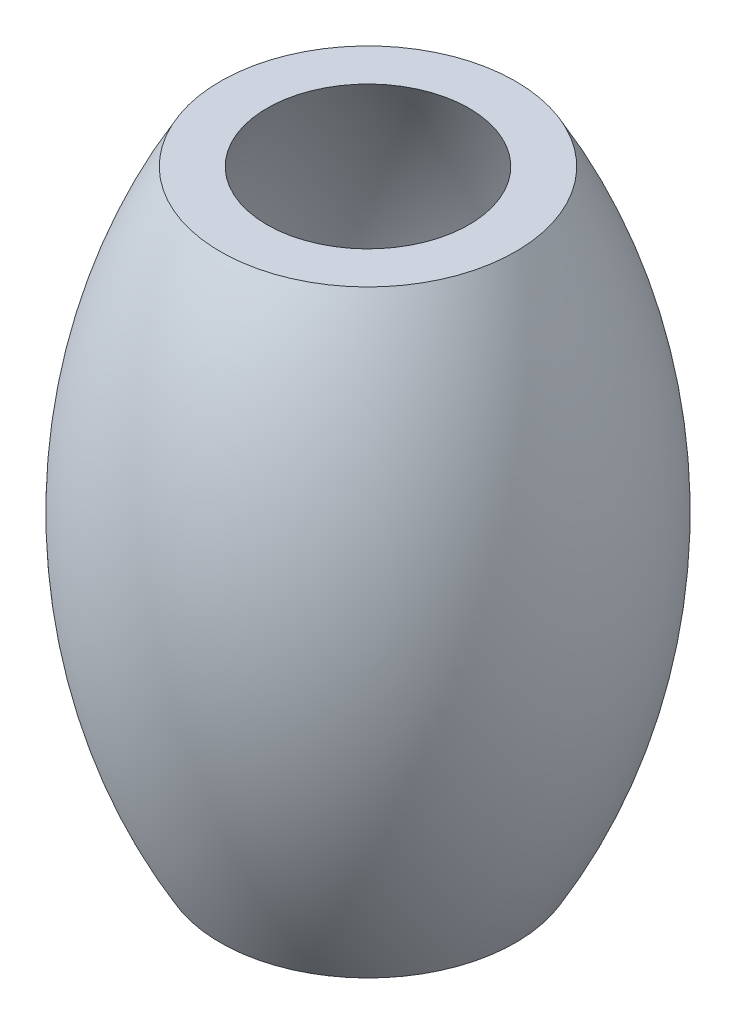
ISO-10303-21;
HEADER;
FILE_DESCRIPTION(('STEP AP214'),'2;1');
FILE_NAME('part.step','',(''),(''),'','','');
FILE_SCHEMA(('AUTOMOTIVE_DESIGN { 1 0 10303 214 1 1 1 1 }'));
ENDSEC;
DATA;
#1=APPLICATION_CONTEXT('core data for automotive mechanical design processes');
#2=APPLICATION_PROTOCOL_DEFINITION('international standard','automotive_design',2000,#1);
#3=PRODUCT_CONTEXT('',#1,'mechanical');
#4=PRODUCT('Part','Part','',(#3));
#5=PRODUCT_RELATED_PRODUCT_CATEGORY('part','',(#4));
#6=PRODUCT_DEFINITION_FORMATION('','',#4);
#7=PRODUCT_DEFINITION_CONTEXT('part definition',#1,'design');
#8=PRODUCT_DEFINITION('design','',#6,#7);
#9=PRODUCT_DEFINITION_SHAPE('','',#8);
#10=(LENGTH_UNIT() NAMED_UNIT(*) SI_UNIT(.MILLI.,.METRE.));
#11=(NAMED_UNIT(*) PLANE_ANGLE_UNIT() SI_UNIT($,.RADIAN.));
#12=(NAMED_UNIT(*) SI_UNIT($,.STERADIAN.) SOLID_ANGLE_UNIT());
#13=UNCERTAINTY_MEASURE_WITH_UNIT(LENGTH_MEASURE(1.E-05),#10,'distance_accuracy_value','');
#14=(GEOMETRIC_REPRESENTATION_CONTEXT(3) GLOBAL_UNCERTAINTY_ASSIGNED_CONTEXT((#13)) GLOBAL_UNIT_ASSIGNED_CONTEXT((#10,
#11,#12)) REPRESENTATION_CONTEXT('',''));
#15=CARTESIAN_POINT('',(0.,0.,0.));
#16=DIRECTION('',(0.,0.,1.));
#17=DIRECTION('',(1.,0.,0.));
#18=AXIS2_PLACEMENT_3D('',#15,#16,#17);
#19=CARTESIAN_POINT('',(0.,0.,0.));
#20=DIRECTION('',(0.,-1.,0.));
#21=DIRECTION('',(0.,0.,-1.));
#22=AXIS2_PLACEMENT_3D('',#19,#20,#21);
#23=DEGENERATE_TOROIDAL_SURFACE('',#22,9.29038105676657,14.,.F.);
#24=CARTESIAN_POINT('',(0.,-7.50000000000002,0.));
#25=DIRECTION('',(0.,-1.,0.));
#26=DIRECTION('',(0.,0.,-1.));
#27=AXIS2_PLACEMENT_3D('',#24,#25,#26);
#28=CIRCLE('',#27,2.53120936077031);
#29=CARTESIAN_POINT('',(0.,-7.50000000000002,-2.53120936077031));
#30=VERTEX_POINT('',#29);
#31=EDGE_CURVE('E46',#30,#30,#28,.T.);
#32=ORIENTED_EDGE('',*,*,#31,.T.);
#33=EDGE_LOOP('',(#32));
#34=FACE_BOUND('',#33,.T.);
#35=CARTESIAN_POINT('',(0.,7.50000000000002,0.));
#36=DIRECTION('',(0.,-1.,0.));
#37=DIRECTION('',(0.,0.,-1.));
#38=AXIS2_PLACEMENT_3D('',#35,#36,#37);
#39=CIRCLE('',#38,2.53120936077031);
#40=CARTESIAN_POINT('',(0.,7.50000000000002,-2.53120936077031));
#41=VERTEX_POINT('',#40);
#42=EDGE_CURVE('E10',#41,#41,#39,.T.);
#43=ORIENTED_EDGE('',*,*,#42,.F.);
#44=EDGE_LOOP('',(#43));
#45=FACE_BOUND('',#44,.T.);
#46=ADVANCED_FACE('F32',(#34,#45),#23,.T.);
#47=CARTESIAN_POINT('',(0.,7.50000000000002,0.));
#48=DIRECTION('',(0.,1.,0.));
#49=DIRECTION('',(0.,0.,1.));
#50=AXIS2_PLACEMENT_3D('',#47,#48,#49);
#51=PLANE('',#50);
#52=ORIENTED_EDGE('',*,*,#42,.T.);
#53=EDGE_LOOP('',(#52));
#54=FACE_BOUND('',#53,.T.);
#55=CARTESIAN_POINT('',(0.,7.50000000000002,0.));
#56=DIRECTION('',(0.,-1.,0.));
#57=DIRECTION('',(0.,0.,-1.));
#58=AXIS2_PLACEMENT_3D('',#55,#56,#57);
#59=CIRCLE('',#58,3.7);
#60=CARTESIAN_POINT('',(0.,7.50000000000002,-3.7));
#61=VERTEX_POINT('',#60);
#62=EDGE_CURVE('E38',#61,#61,#59,.T.);
#63=ORIENTED_EDGE('',*,*,#62,.F.);
#64=EDGE_LOOP('',(#63));
#65=FACE_BOUND('',#64,.T.);
#66=ADVANCED_FACE('F62',(#54,#65),#51,.T.);
#67=CARTESIAN_POINT('',(0.,0.,0.));
#68=DIRECTION('',(0.,-1.,0.));
#69=DIRECTION('',(0.,0.,-1.));
#70=AXIS2_PLACEMENT_3D('',#67,#68,#69);
#71=DEGENERATE_TOROIDAL_SURFACE('',#70,9.29038105676657,15.,.F.);
#72=CARTESIAN_POINT('',(0.,-7.50000000000002,0.));
#73=DIRECTION('',(0.,-1.,0.));
#74=DIRECTION('',(0.,0.,-1.));
#75=AXIS2_PLACEMENT_3D('',#72,#73,#74);
#76=CIRCLE('',#75,3.7);
#77=CARTESIAN_POINT('',(0.,-7.50000000000002,-3.7));
#78=VERTEX_POINT('',#77);
#79=EDGE_CURVE('E42',#78,#78,#76,.T.);
#80=ORIENTED_EDGE('',*,*,#79,.F.);
#81=EDGE_LOOP('',(#80));
#82=FACE_BOUND('',#81,.T.);
#83=ORIENTED_EDGE('',*,*,#62,.T.);
#84=EDGE_LOOP('',(#83));
#85=FACE_BOUND('',#84,.T.);
#86=ADVANCED_FACE('F57',(#82,#85),#71,.F.);
#87=CARTESIAN_POINT('',(0.,-7.50000000000002,0.));
#88=DIRECTION('',(0.,1.,0.));
#89=DIRECTION('',(0.,0.,1.));
#90=AXIS2_PLACEMENT_3D('',#87,#88,#89);
#91=PLANE('',#90);
#92=ORIENTED_EDGE('',*,*,#31,.F.);
#93=EDGE_LOOP('',(#92));
#94=FACE_BOUND('',#93,.T.);
#95=ORIENTED_EDGE('',*,*,#79,.T.);
#96=EDGE_LOOP('',(#95));
#97=FACE_BOUND('',#96,.T.);
#98=ADVANCED_FACE('F54',(#94,#97),#91,.F.);
#99=CLOSED_SHELL('',(#46,#66,#86,#98));
#100=MANIFOLD_SOLID_BREP('B2',#99);
#101=ADVANCED_BREP_SHAPE_REPRESENTATION('',(#18,#100),#14);
#102=SHAPE_DEFINITION_REPRESENTATION(#9,#101);
ENDSEC;
END-ISO-10303-21;
